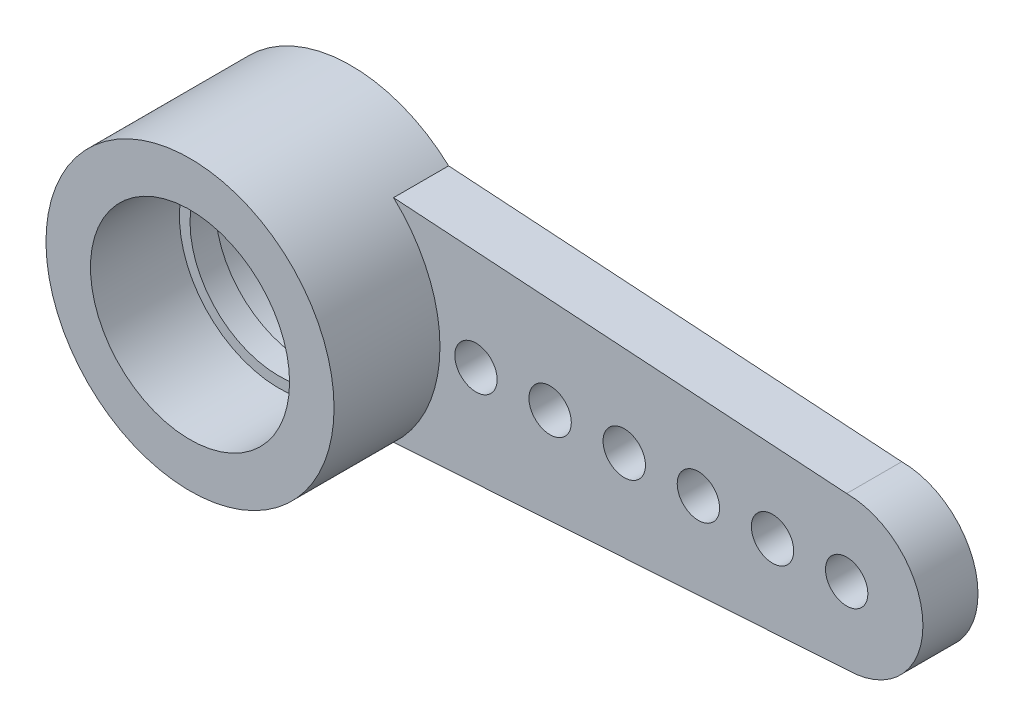
ISO-10303-21;
HEADER;
FILE_DESCRIPTION(('STEP AP214'),'2;1');
FILE_NAME('part.step','',(''),(''),'','','');
FILE_SCHEMA(('AUTOMOTIVE_DESIGN { 1 0 10303 214 1 1 1 1 }'));
ENDSEC;
DATA;
#1=APPLICATION_CONTEXT('core data for automotive mechanical design processes');
#2=APPLICATION_PROTOCOL_DEFINITION('international standard','automotive_design',2000,#1);
#3=PRODUCT_CONTEXT('',#1,'mechanical');
#4=PRODUCT('Part','Part','',(#3));
#5=PRODUCT_RELATED_PRODUCT_CATEGORY('part','',(#4));
#6=PRODUCT_DEFINITION_FORMATION('','',#4);
#7=PRODUCT_DEFINITION_CONTEXT('part definition',#1,'design');
#8=PRODUCT_DEFINITION('design','',#6,#7);
#9=PRODUCT_DEFINITION_SHAPE('','',#8);
#10=(LENGTH_UNIT() NAMED_UNIT(*) SI_UNIT(.MILLI.,.METRE.));
#11=(NAMED_UNIT(*) PLANE_ANGLE_UNIT() SI_UNIT($,.RADIAN.));
#12=(NAMED_UNIT(*) SI_UNIT($,.STERADIAN.) SOLID_ANGLE_UNIT());
#13=UNCERTAINTY_MEASURE_WITH_UNIT(LENGTH_MEASURE(1.E-05),#10,'distance_accuracy_value','');
#14=(GEOMETRIC_REPRESENTATION_CONTEXT(3) GLOBAL_UNCERTAINTY_ASSIGNED_CONTEXT((#13)) GLOBAL_UNIT_ASSIGNED_CONTEXT((#10,
#11,#12)) REPRESENTATION_CONTEXT('',''));
#15=CARTESIAN_POINT('',(0.,0.,0.));
#16=DIRECTION('',(0.,0.,1.));
#17=DIRECTION('',(1.,0.,0.));
#18=AXIS2_PLACEMENT_3D('',#15,#16,#17);
#19=CARTESIAN_POINT('',(0.,0.,-6.64680374315355));
#20=DIRECTION('',(0.,0.,1.));
#21=DIRECTION('',(1.,0.,0.));
#22=AXIS2_PLACEMENT_3D('',#19,#20,#21);
#23=CYLINDRICAL_SURFACE('',#22,2.35);
#24=CARTESIAN_POINT('',(0.,0.,1.1));
#25=DIRECTION('',(0.,0.,-1.));
#26=DIRECTION('',(-1.,0.,0.));
#27=AXIS2_PLACEMENT_3D('',#24,#25,#26);
#28=CIRCLE('',#27,2.35);
#29=CARTESIAN_POINT('',(-2.35,0.,1.1));
#30=VERTEX_POINT('',#29);
#31=EDGE_CURVE('E137',#30,#30,#28,.T.);
#32=ORIENTED_EDGE('',*,*,#31,.F.);
#33=EDGE_LOOP('',(#32));
#34=FACE_BOUND('',#33,.T.);
#35=CARTESIAN_POINT('',(0.,0.,0.));
#36=DIRECTION('',(0.,0.,1.));
#37=DIRECTION('',(1.,0.,0.));
#38=AXIS2_PLACEMENT_3D('',#35,#36,#37);
#39=CIRCLE('',#38,2.35);
#40=CARTESIAN_POINT('',(2.35,0.,0.));
#41=VERTEX_POINT('',#40);
#42=EDGE_CURVE('E117',#41,#41,#39,.F.);
#43=ORIENTED_EDGE('',*,*,#42,.T.);
#44=EDGE_LOOP('',(#43));
#45=FACE_BOUND('',#44,.T.);
#46=ADVANCED_FACE('F46',(#34,#45),#23,.F.);
#47=CARTESIAN_POINT('',(13.,0.,1.3));
#48=DIRECTION('',(0.,0.,-1.));
#49=DIRECTION('',(-1.,0.,0.));
#50=AXIS2_PLACEMENT_3D('',#47,#48,#49);
#51=CYLINDRICAL_SURFACE('',#50,1.8);
#52=CARTESIAN_POINT('',(13.,0.,0.));
#53=DIRECTION('',(0.,0.,1.));
#54=DIRECTION('',(1.,0.,0.));
#55=AXIS2_PLACEMENT_3D('',#52,#53,#54);
#56=CIRCLE('',#55,1.8);
#57=CARTESIAN_POINT('',(13.,-1.8,0.));
#58=VERTEX_POINT('',#57);
#59=CARTESIAN_POINT('',(13.,1.8,0.));
#60=VERTEX_POINT('',#59);
#61=EDGE_CURVE('E114',#58,#60,#56,.T.);
#62=ORIENTED_EDGE('',*,*,#61,.T.);
#63=DIRECTION('',(0.,0.,-1.));
#64=VECTOR('',#63,1.);
#65=CARTESIAN_POINT('',(13.,1.8,1.3));
#66=LINE('',#65,#64);
#67=CARTESIAN_POINT('',(13.,1.8,1.3));
#68=VERTEX_POINT('',#67);
#69=EDGE_CURVE('E50',#68,#60,#66,.T.);
#70=ORIENTED_EDGE('',*,*,#69,.F.);
#71=CARTESIAN_POINT('',(13.,0.,1.3));
#72=DIRECTION('',(0.,0.,1.));
#73=DIRECTION('',(1.,0.,0.));
#74=AXIS2_PLACEMENT_3D('',#71,#72,#73);
#75=CIRCLE('',#74,1.8);
#76=CARTESIAN_POINT('',(13.,-1.8,1.3));
#77=VERTEX_POINT('',#76);
#78=EDGE_CURVE('E102',#77,#68,#75,.T.);
#79=ORIENTED_EDGE('',*,*,#78,.F.);
#80=DIRECTION('',(0.,0.,-1.));
#81=VECTOR('',#80,1.);
#82=CARTESIAN_POINT('',(13.,-1.8,1.3));
#83=LINE('',#82,#81);
#84=EDGE_CURVE('E107',#77,#58,#83,.T.);
#85=ORIENTED_EDGE('',*,*,#84,.T.);
#86=EDGE_LOOP('',(#62,#70,#79,#85));
#87=FACE_BOUND('',#86,.T.);
#88=ADVANCED_FACE('F48',(#87),#51,.T.);
#89=CARTESIAN_POINT('',(13.,1.8,1.3));
#90=DIRECTION('',(-0.0653074123335915,-0.99786519224507,0.));
#91=DIRECTION('',(0.99786519224507,-0.0653074123335915,0.));
#92=AXIS2_PLACEMENT_3D('',#89,#90,#91);
#93=PLANE('',#92);
#94=DIRECTION('',(-0.99786519224507,0.0653074123335915,0.));
#95=VECTOR('',#94,1.);
#96=CARTESIAN_POINT('',(13.,1.8,0.));
#97=LINE('',#96,#95);
#98=CARTESIAN_POINT('',(2.30434372436058,2.5,0.));
#99=VERTEX_POINT('',#98);
#100=EDGE_CURVE('E98',#60,#99,#97,.T.);
#101=ORIENTED_EDGE('',*,*,#100,.T.);
#102=DIRECTION('',(0.,0.,-1.));
#103=VECTOR('',#102,1.);
#104=CARTESIAN_POINT('',(2.30434372436058,2.5,1.3));
#105=LINE('',#104,#103);
#106=CARTESIAN_POINT('',(2.30434372436058,2.5,1.3));
#107=VERTEX_POINT('',#106);
#108=EDGE_CURVE('E96',#107,#99,#105,.T.);
#109=ORIENTED_EDGE('',*,*,#108,.F.);
#110=DIRECTION('',(-0.99786519224507,0.0653074123335915,0.));
#111=VECTOR('',#110,1.);
#112=CARTESIAN_POINT('',(13.,1.8,1.3));
#113=LINE('',#112,#111);
#114=EDGE_CURVE('E94',#68,#107,#113,.T.);
#115=ORIENTED_EDGE('',*,*,#114,.F.);
#116=ORIENTED_EDGE('',*,*,#69,.T.);
#117=EDGE_LOOP('',(#101,#109,#115,#116));
#118=FACE_BOUND('',#117,.T.);
#119=ADVANCED_FACE('F97',(#118),#93,.F.);
#120=CARTESIAN_POINT('',(0.,0.,1.3));
#121=DIRECTION('',(0.,0.,-1.));
#122=DIRECTION('',(-1.,0.,0.));
#123=AXIS2_PLACEMENT_3D('',#120,#121,#122);
#124=CYLINDRICAL_SURFACE('',#123,3.4);
#125=CARTESIAN_POINT('',(0.,0.,0.));
#126=DIRECTION('',(0.,0.,1.));
#127=DIRECTION('',(1.,0.,0.));
#128=AXIS2_PLACEMENT_3D('',#125,#126,#127);
#129=CIRCLE('',#128,3.4);
#130=CARTESIAN_POINT('',(2.30434372436058,-2.5,0.));
#131=VERTEX_POINT('',#130);
#132=EDGE_CURVE('E82',#99,#131,#129,.T.);
#133=ORIENTED_EDGE('',*,*,#132,.T.);
#134=DIRECTION('',(0.,0.,-1.));
#135=VECTOR('',#134,1.);
#136=CARTESIAN_POINT('',(2.30434372436058,-2.5,1.3));
#137=LINE('',#136,#135);
#138=CARTESIAN_POINT('',(2.30434372436058,-2.5,1.3));
#139=VERTEX_POINT('',#138);
#140=EDGE_CURVE('E99',#139,#131,#137,.T.);
#141=ORIENTED_EDGE('',*,*,#140,.F.);
#142=CARTESIAN_POINT('',(0.,0.,1.3));
#143=DIRECTION('',(0.,0.,1.));
#144=DIRECTION('',(1.,0.,0.));
#145=AXIS2_PLACEMENT_3D('',#142,#143,#144);
#146=CIRCLE('',#145,3.4);
#147=EDGE_CURVE('E12',#139,#107,#146,.T.);
#148=ORIENTED_EDGE('',*,*,#147,.T.);
#149=ORIENTED_EDGE('',*,*,#108,.T.);
#150=EDGE_LOOP('',(#133,#141,#148,#149));
#151=FACE_BOUND('',#150,.T.);
#152=CARTESIAN_POINT('',(0.,0.,3.8));
#153=DIRECTION('',(0.,0.,1.));
#154=DIRECTION('',(1.,0.,0.));
#155=AXIS2_PLACEMENT_3D('',#152,#153,#154);
#156=CIRCLE('',#155,3.4);
#157=CARTESIAN_POINT('',(3.4,0.,3.8));
#158=VERTEX_POINT('',#157);
#159=EDGE_CURVE('E122',#158,#158,#156,.T.);
#160=ORIENTED_EDGE('',*,*,#159,.F.);
#161=EDGE_LOOP('',(#160));
#162=FACE_BOUND('',#161,.T.);
#163=ADVANCED_FACE('F105',(#151,#162),#124,.T.);
#164=CARTESIAN_POINT('',(13.,-1.8,1.3));
#165=DIRECTION('',(-0.0653074123335915,0.99786519224507,0.));
#166=DIRECTION('',(-0.99786519224507,-0.0653074123335915,0.));
#167=AXIS2_PLACEMENT_3D('',#164,#165,#166);
#168=PLANE('',#167);
#169=DIRECTION('',(0.99786519224507,0.0653074123335915,0.));
#170=VECTOR('',#169,1.);
#171=CARTESIAN_POINT('',(13.,-1.8,0.));
#172=LINE('',#171,#170);
#173=EDGE_CURVE('E87',#131,#58,#172,.T.);
#174=ORIENTED_EDGE('',*,*,#173,.T.);
#175=ORIENTED_EDGE('',*,*,#84,.F.);
#176=DIRECTION('',(0.99786519224507,0.0653074123335915,0.));
#177=VECTOR('',#176,1.);
#178=CARTESIAN_POINT('',(13.,-1.8,1.3));
#179=LINE('',#178,#177);
#180=EDGE_CURVE('E64',#139,#77,#179,.T.);
#181=ORIENTED_EDGE('',*,*,#180,.F.);
#182=ORIENTED_EDGE('',*,*,#140,.T.);
#183=EDGE_LOOP('',(#174,#175,#181,#182));
#184=FACE_BOUND('',#183,.T.);
#185=ADVANCED_FACE('F109',(#184),#168,.F.);
#186=CARTESIAN_POINT('',(13.,0.,1.3));
#187=DIRECTION('',(0.,0.,1.));
#188=DIRECTION('',(1.,0.,0.));
#189=AXIS2_PLACEMENT_3D('',#186,#187,#188);
#190=PLANE('',#189);
#191=CARTESIAN_POINT('',(13.,0.,1.3));
#192=DIRECTION('',(0.,0.,1.));
#193=DIRECTION('',(1.,0.,0.));
#194=AXIS2_PLACEMENT_3D('',#191,#192,#193);
#195=CIRCLE('',#194,0.500000000000001);
#196=CARTESIAN_POINT('',(13.5,0.,1.3));
#197=VERTEX_POINT('',#196);
#198=EDGE_CURVE('E172',#197,#197,#195,.F.);
#199=ORIENTED_EDGE('',*,*,#198,.T.);
#200=EDGE_LOOP('',(#199));
#201=FACE_BOUND('',#200,.T.);
#202=CARTESIAN_POINT('',(11.25,0.,1.3));
#203=DIRECTION('',(0.,0.,1.));
#204=DIRECTION('',(1.,0.,0.));
#205=AXIS2_PLACEMENT_3D('',#202,#203,#204);
#206=CIRCLE('',#205,0.500000000000001);
#207=CARTESIAN_POINT('',(11.75,0.,1.3));
#208=VERTEX_POINT('',#207);
#209=EDGE_CURVE('E166',#208,#208,#206,.F.);
#210=ORIENTED_EDGE('',*,*,#209,.T.);
#211=EDGE_LOOP('',(#210));
#212=FACE_BOUND('',#211,.T.);
#213=CARTESIAN_POINT('',(9.5,0.,1.3));
#214=DIRECTION('',(0.,0.,1.));
#215=DIRECTION('',(1.,0.,0.));
#216=AXIS2_PLACEMENT_3D('',#213,#214,#215);
#217=CIRCLE('',#216,0.500000000000001);
#218=CARTESIAN_POINT('',(10.,0.,1.3));
#219=VERTEX_POINT('',#218);
#220=EDGE_CURVE('E160',#219,#219,#217,.F.);
#221=ORIENTED_EDGE('',*,*,#220,.T.);
#222=EDGE_LOOP('',(#221));
#223=FACE_BOUND('',#222,.T.);
#224=CARTESIAN_POINT('',(7.75,0.,1.3));
#225=DIRECTION('',(0.,0.,1.));
#226=DIRECTION('',(1.,0.,0.));
#227=AXIS2_PLACEMENT_3D('',#224,#225,#226);
#228=CIRCLE('',#227,0.500000000000001);
#229=CARTESIAN_POINT('',(8.25,0.,1.3));
#230=VERTEX_POINT('',#229);
#231=EDGE_CURVE('E154',#230,#230,#228,.F.);
#232=ORIENTED_EDGE('',*,*,#231,.T.);
#233=EDGE_LOOP('',(#232));
#234=FACE_BOUND('',#233,.T.);
#235=CARTESIAN_POINT('',(6.,0.,1.3));
#236=DIRECTION('',(0.,0.,1.));
#237=DIRECTION('',(1.,0.,0.));
#238=AXIS2_PLACEMENT_3D('',#235,#236,#237);
#239=CIRCLE('',#238,0.500000000000001);
#240=CARTESIAN_POINT('',(6.5,0.,1.3));
#241=VERTEX_POINT('',#240);
#242=EDGE_CURVE('E148',#241,#241,#239,.F.);
#243=ORIENTED_EDGE('',*,*,#242,.T.);
#244=EDGE_LOOP('',(#243));
#245=FACE_BOUND('',#244,.T.);
#246=CARTESIAN_POINT('',(4.25,0.,1.3));
#247=DIRECTION('',(0.,0.,1.));
#248=DIRECTION('',(1.,0.,0.));
#249=AXIS2_PLACEMENT_3D('',#246,#247,#248);
#250=CIRCLE('',#249,0.500000000000001);
#251=CARTESIAN_POINT('',(4.75,0.,1.3));
#252=VERTEX_POINT('',#251);
#253=EDGE_CURVE('E142',#252,#252,#250,.F.);
#254=ORIENTED_EDGE('',*,*,#253,.T.);
#255=EDGE_LOOP('',(#254));
#256=FACE_BOUND('',#255,.T.);
#257=ORIENTED_EDGE('',*,*,#147,.F.);
#258=ORIENTED_EDGE('',*,*,#180,.T.);
#259=ORIENTED_EDGE('',*,*,#78,.T.);
#260=ORIENTED_EDGE('',*,*,#114,.T.);
#261=EDGE_LOOP('',(#257,#258,#259,#260));
#262=FACE_BOUND('',#261,.T.);
#263=ADVANCED_FACE('F100',(#201,#212,#223,#234,#245,#256,#262),#190,.T.);
#264=CARTESIAN_POINT('',(13.,0.,0.));
#265=DIRECTION('',(0.,0.,1.));
#266=DIRECTION('',(1.,0.,0.));
#267=AXIS2_PLACEMENT_3D('',#264,#265,#266);
#268=PLANE('',#267);
#269=CARTESIAN_POINT('',(13.,0.,0.));
#270=DIRECTION('',(0.,0.,-1.));
#271=DIRECTION('',(-1.,0.,0.));
#272=AXIS2_PLACEMENT_3D('',#269,#270,#271);
#273=CIRCLE('',#272,0.500000000000001);
#274=CARTESIAN_POINT('',(12.5,0.,0.));
#275=VERTEX_POINT('',#274);
#276=EDGE_CURVE('E134',#275,#275,#273,.T.);
#277=ORIENTED_EDGE('',*,*,#276,.F.);
#278=EDGE_LOOP('',(#277));
#279=FACE_BOUND('',#278,.T.);
#280=CARTESIAN_POINT('',(11.25,0.,0.));
#281=DIRECTION('',(0.,0.,-1.));
#282=DIRECTION('',(-1.,0.,0.));
#283=AXIS2_PLACEMENT_3D('',#280,#281,#282);
#284=CIRCLE('',#283,0.500000000000001);
#285=CARTESIAN_POINT('',(10.75,0.,0.));
#286=VERTEX_POINT('',#285);
#287=EDGE_CURVE('E169',#286,#286,#284,.T.);
#288=ORIENTED_EDGE('',*,*,#287,.F.);
#289=EDGE_LOOP('',(#288));
#290=FACE_BOUND('',#289,.T.);
#291=CARTESIAN_POINT('',(9.5,0.,0.));
#292=DIRECTION('',(0.,0.,-1.));
#293=DIRECTION('',(-1.,0.,0.));
#294=AXIS2_PLACEMENT_3D('',#291,#292,#293);
#295=CIRCLE('',#294,0.500000000000001);
#296=CARTESIAN_POINT('',(9.,0.,0.));
#297=VERTEX_POINT('',#296);
#298=EDGE_CURVE('E163',#297,#297,#295,.T.);
#299=ORIENTED_EDGE('',*,*,#298,.F.);
#300=EDGE_LOOP('',(#299));
#301=FACE_BOUND('',#300,.T.);
#302=CARTESIAN_POINT('',(7.75,0.,0.));
#303=DIRECTION('',(0.,0.,-1.));
#304=DIRECTION('',(-1.,0.,0.));
#305=AXIS2_PLACEMENT_3D('',#302,#303,#304);
#306=CIRCLE('',#305,0.500000000000001);
#307=CARTESIAN_POINT('',(7.25,0.,0.));
#308=VERTEX_POINT('',#307);
#309=EDGE_CURVE('E157',#308,#308,#306,.T.);
#310=ORIENTED_EDGE('',*,*,#309,.F.);
#311=EDGE_LOOP('',(#310));
#312=FACE_BOUND('',#311,.T.);
#313=CARTESIAN_POINT('',(6.,0.,0.));
#314=DIRECTION('',(0.,0.,-1.));
#315=DIRECTION('',(-1.,0.,0.));
#316=AXIS2_PLACEMENT_3D('',#313,#314,#315);
#317=CIRCLE('',#316,0.500000000000001);
#318=CARTESIAN_POINT('',(5.5,0.,0.));
#319=VERTEX_POINT('',#318);
#320=EDGE_CURVE('E151',#319,#319,#317,.T.);
#321=ORIENTED_EDGE('',*,*,#320,.F.);
#322=EDGE_LOOP('',(#321));
#323=FACE_BOUND('',#322,.T.);
#324=CARTESIAN_POINT('',(4.25,0.,0.));
#325=DIRECTION('',(0.,0.,-1.));
#326=DIRECTION('',(-1.,0.,0.));
#327=AXIS2_PLACEMENT_3D('',#324,#325,#326);
#328=CIRCLE('',#327,0.500000000000001);
#329=CARTESIAN_POINT('',(3.75,0.,0.));
#330=VERTEX_POINT('',#329);
#331=EDGE_CURVE('E145',#330,#330,#328,.T.);
#332=ORIENTED_EDGE('',*,*,#331,.F.);
#333=EDGE_LOOP('',(#332));
#334=FACE_BOUND('',#333,.T.);
#335=ORIENTED_EDGE('',*,*,#42,.F.);
#336=EDGE_LOOP('',(#335));
#337=FACE_BOUND('',#336,.T.);
#338=ORIENTED_EDGE('',*,*,#61,.F.);
#339=ORIENTED_EDGE('',*,*,#173,.F.);
#340=ORIENTED_EDGE('',*,*,#132,.F.);
#341=ORIENTED_EDGE('',*,*,#100,.F.);
#342=EDGE_LOOP('',(#338,#339,#340,#341));
#343=FACE_BOUND('',#342,.T.);
#344=ADVANCED_FACE('F180',(#279,#290,#301,#312,#323,#334,#337,#343),#268,.F.);
#345=CARTESIAN_POINT('',(0.,0.,1.7));
#346=DIRECTION('',(0.,0.,1.));
#347=DIRECTION('',(1.,0.,0.));
#348=AXIS2_PLACEMENT_3D('',#345,#346,#347);
#349=CIRCLE('',#348,2.35);
#350=CARTESIAN_POINT('',(2.35,0.,1.7));
#351=VERTEX_POINT('',#350);
#352=EDGE_CURVE('E130',#351,#351,#349,.F.);
#353=ORIENTED_EDGE('',*,*,#352,.T.);
#354=EDGE_LOOP('',(#353));
#355=FACE_BOUND('',#354,.T.);
#356=CARTESIAN_POINT('',(0.,0.,3.8));
#357=DIRECTION('',(0.,0.,1.));
#358=DIRECTION('',(1.,0.,0.));
#359=AXIS2_PLACEMENT_3D('',#356,#357,#358);
#360=CIRCLE('',#359,2.35);
#361=CARTESIAN_POINT('',(2.35,0.,3.8));
#362=VERTEX_POINT('',#361);
#363=EDGE_CURVE('E126',#362,#362,#360,.T.);
#364=ORIENTED_EDGE('',*,*,#363,.T.);
#365=EDGE_LOOP('',(#364));
#366=FACE_BOUND('',#365,.T.);
#367=ADVANCED_FACE('F183',(#355,#366),#23,.F.);
#368=CARTESIAN_POINT('',(0.,0.,3.8));
#369=DIRECTION('',(0.,0.,1.));
#370=DIRECTION('',(1.,0.,0.));
#371=AXIS2_PLACEMENT_3D('',#368,#369,#370);
#372=PLANE('',#371);
#373=ORIENTED_EDGE('',*,*,#159,.T.);
#374=EDGE_LOOP('',(#373));
#375=FACE_BOUND('',#374,.T.);
#376=ORIENTED_EDGE('',*,*,#363,.F.);
#377=EDGE_LOOP('',(#376));
#378=FACE_BOUND('',#377,.T.);
#379=ADVANCED_FACE('F213',(#375,#378),#372,.T.);
#380=CARTESIAN_POINT('',(0.,0.,10.4468037431535));
#381=DIRECTION('',(0.,0.,-1.));
#382=DIRECTION('',(-1.,0.,0.));
#383=AXIS2_PLACEMENT_3D('',#380,#381,#382);
#384=CYLINDRICAL_SURFACE('',#383,2.1);
#385=CARTESIAN_POINT('',(0.,0.,1.1));
#386=DIRECTION('',(0.,0.,-1.));
#387=DIRECTION('',(-1.,0.,0.));
#388=AXIS2_PLACEMENT_3D('',#385,#386,#387);
#389=CIRCLE('',#388,2.1);
#390=CARTESIAN_POINT('',(-2.1,0.,1.1));
#391=VERTEX_POINT('',#390);
#392=EDGE_CURVE('E133',#391,#391,#389,.T.);
#393=ORIENTED_EDGE('',*,*,#392,.T.);
#394=EDGE_LOOP('',(#393));
#395=FACE_BOUND('',#394,.T.);
#396=CARTESIAN_POINT('',(0.,0.,1.7));
#397=DIRECTION('',(0.,0.,1.));
#398=DIRECTION('',(1.,0.,0.));
#399=AXIS2_PLACEMENT_3D('',#396,#397,#398);
#400=CIRCLE('',#399,2.1);
#401=CARTESIAN_POINT('',(2.1,0.,1.7));
#402=VERTEX_POINT('',#401);
#403=EDGE_CURVE('E129',#402,#402,#400,.F.);
#404=ORIENTED_EDGE('',*,*,#403,.F.);
#405=EDGE_LOOP('',(#404));
#406=FACE_BOUND('',#405,.T.);
#407=ADVANCED_FACE('F218',(#395,#406),#384,.F.);
#408=CARTESIAN_POINT('',(0.,0.,1.1));
#409=DIRECTION('',(0.,0.,-1.));
#410=DIRECTION('',(-1.,0.,0.));
#411=AXIS2_PLACEMENT_3D('',#408,#409,#410);
#412=PLANE('',#411);
#413=ORIENTED_EDGE('',*,*,#392,.F.);
#414=EDGE_LOOP('',(#413));
#415=FACE_BOUND('',#414,.T.);
#416=ORIENTED_EDGE('',*,*,#31,.T.);
#417=EDGE_LOOP('',(#416));
#418=FACE_BOUND('',#417,.T.);
#419=ADVANCED_FACE('F229',(#415,#418),#412,.T.);
#420=CARTESIAN_POINT('',(0.,0.,1.7));
#421=DIRECTION('',(0.,0.,1.));
#422=DIRECTION('',(1.,0.,0.));
#423=AXIS2_PLACEMENT_3D('',#420,#421,#422);
#424=PLANE('',#423);
#425=ORIENTED_EDGE('',*,*,#352,.F.);
#426=EDGE_LOOP('',(#425));
#427=FACE_BOUND('',#426,.T.);
#428=ORIENTED_EDGE('',*,*,#403,.T.);
#429=EDGE_LOOP('',(#428));
#430=FACE_BOUND('',#429,.T.);
#431=ADVANCED_FACE('F225',(#427,#430),#424,.T.);
#432=CARTESIAN_POINT('',(4.25,0.,3.801));
#433=DIRECTION('',(0.,0.,-1.));
#434=DIRECTION('',(-1.,0.,0.));
#435=AXIS2_PLACEMENT_3D('',#432,#433,#434);
#436=CYLINDRICAL_SURFACE('',#435,0.500000000000001);
#437=ORIENTED_EDGE('',*,*,#253,.F.);
#438=EDGE_LOOP('',(#437));
#439=FACE_BOUND('',#438,.T.);
#440=ORIENTED_EDGE('',*,*,#331,.T.);
#441=EDGE_LOOP('',(#440));
#442=FACE_BOUND('',#441,.T.);
#443=ADVANCED_FACE('F228',(#439,#442),#436,.F.);
#444=CARTESIAN_POINT('',(6.,0.,3.801));
#445=DIRECTION('',(0.,0.,-1.));
#446=DIRECTION('',(-1.,0.,0.));
#447=AXIS2_PLACEMENT_3D('',#444,#445,#446);
#448=CYLINDRICAL_SURFACE('',#447,0.500000000000001);
#449=ORIENTED_EDGE('',*,*,#242,.F.);
#450=EDGE_LOOP('',(#449));
#451=FACE_BOUND('',#450,.T.);
#452=ORIENTED_EDGE('',*,*,#320,.T.);
#453=EDGE_LOOP('',(#452));
#454=FACE_BOUND('',#453,.T.);
#455=ADVANCED_FACE('F244',(#451,#454),#448,.F.);
#456=CARTESIAN_POINT('',(7.75,0.,3.801));
#457=DIRECTION('',(0.,0.,-1.));
#458=DIRECTION('',(-1.,0.,0.));
#459=AXIS2_PLACEMENT_3D('',#456,#457,#458);
#460=CYLINDRICAL_SURFACE('',#459,0.500000000000001);
#461=ORIENTED_EDGE('',*,*,#231,.F.);
#462=EDGE_LOOP('',(#461));
#463=FACE_BOUND('',#462,.T.);
#464=ORIENTED_EDGE('',*,*,#309,.T.);
#465=EDGE_LOOP('',(#464));
#466=FACE_BOUND('',#465,.T.);
#467=ADVANCED_FACE('F248',(#463,#466),#460,.F.);
#468=CARTESIAN_POINT('',(9.5,0.,3.801));
#469=DIRECTION('',(0.,0.,-1.));
#470=DIRECTION('',(-1.,0.,0.));
#471=AXIS2_PLACEMENT_3D('',#468,#469,#470);
#472=CYLINDRICAL_SURFACE('',#471,0.500000000000001);
#473=ORIENTED_EDGE('',*,*,#220,.F.);
#474=EDGE_LOOP('',(#473));
#475=FACE_BOUND('',#474,.T.);
#476=ORIENTED_EDGE('',*,*,#298,.T.);
#477=EDGE_LOOP('',(#476));
#478=FACE_BOUND('',#477,.T.);
#479=ADVANCED_FACE('F252',(#475,#478),#472,.F.);
#480=CARTESIAN_POINT('',(11.25,0.,3.801));
#481=DIRECTION('',(0.,0.,-1.));
#482=DIRECTION('',(-1.,0.,0.));
#483=AXIS2_PLACEMENT_3D('',#480,#481,#482);
#484=CYLINDRICAL_SURFACE('',#483,0.500000000000001);
#485=ORIENTED_EDGE('',*,*,#209,.F.);
#486=EDGE_LOOP('',(#485));
#487=FACE_BOUND('',#486,.T.);
#488=ORIENTED_EDGE('',*,*,#287,.T.);
#489=EDGE_LOOP('',(#488));
#490=FACE_BOUND('',#489,.T.);
#491=ADVANCED_FACE('F256',(#487,#490),#484,.F.);
#492=CARTESIAN_POINT('',(13.,0.,3.801));
#493=DIRECTION('',(0.,0.,-1.));
#494=DIRECTION('',(-1.,0.,0.));
#495=AXIS2_PLACEMENT_3D('',#492,#493,#494);
#496=CYLINDRICAL_SURFACE('',#495,0.500000000000001);
#497=ORIENTED_EDGE('',*,*,#198,.F.);
#498=EDGE_LOOP('',(#497));
#499=FACE_BOUND('',#498,.T.);
#500=ORIENTED_EDGE('',*,*,#276,.T.);
#501=EDGE_LOOP('',(#500));
#502=FACE_BOUND('',#501,.T.);
#503=ADVANCED_FACE('F178',(#499,#502),#496,.F.);
#504=CLOSED_SHELL('',(#46,#88,#119,#163,#185,#263,#344,#367,#379,#407,#419,#431,#443,#455,#467,
#479,#491,#503));
#505=MANIFOLD_SOLID_BREP('B2',#504);
#506=ADVANCED_BREP_SHAPE_REPRESENTATION('',(#18,#505),#14);
#507=SHAPE_DEFINITION_REPRESENTATION(#9,#506);
ENDSEC;
END-ISO-10303-21;
